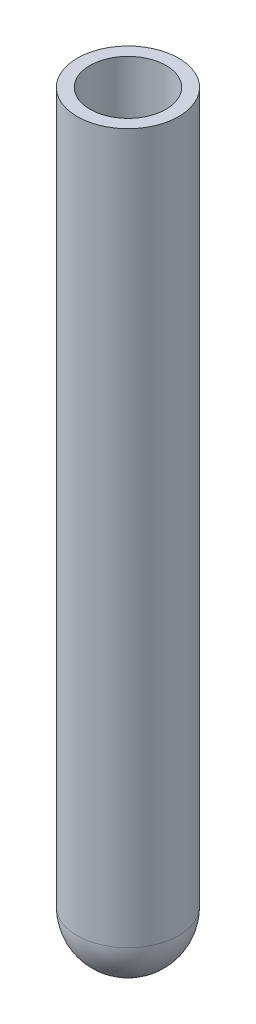
ISO-10303-21;
HEADER;
FILE_DESCRIPTION(('STEP AP214'),'2;1');
FILE_NAME('part.step','',(''),(''),'','','');
FILE_SCHEMA(('AUTOMOTIVE_DESIGN { 1 0 10303 214 1 1 1 1 }'));
ENDSEC;
DATA;
#1=APPLICATION_CONTEXT('core data for automotive mechanical design processes');
#2=APPLICATION_PROTOCOL_DEFINITION('international standard','automotive_design',2000,#1);
#3=PRODUCT_CONTEXT('',#1,'mechanical');
#4=PRODUCT('Part','Part','',(#3));
#5=PRODUCT_RELATED_PRODUCT_CATEGORY('part','',(#4));
#6=PRODUCT_DEFINITION_FORMATION('','',#4);
#7=PRODUCT_DEFINITION_CONTEXT('part definition',#1,'design');
#8=PRODUCT_DEFINITION('design','',#6,#7);
#9=PRODUCT_DEFINITION_SHAPE('','',#8);
#10=(LENGTH_UNIT() NAMED_UNIT(*) SI_UNIT(.MILLI.,.METRE.));
#11=(NAMED_UNIT(*) PLANE_ANGLE_UNIT() SI_UNIT($,.RADIAN.));
#12=(NAMED_UNIT(*) SI_UNIT($,.STERADIAN.) SOLID_ANGLE_UNIT());
#13=UNCERTAINTY_MEASURE_WITH_UNIT(LENGTH_MEASURE(1.E-05),#10,'distance_accuracy_value','');
#14=(GEOMETRIC_REPRESENTATION_CONTEXT(3) GLOBAL_UNCERTAINTY_ASSIGNED_CONTEXT((#13)) GLOBAL_UNIT_ASSIGNED_CONTEXT((#10,
#11,#12)) REPRESENTATION_CONTEXT('',''));
#15=CARTESIAN_POINT('',(0.,0.,0.));
#16=DIRECTION('',(0.,0.,1.));
#17=DIRECTION('',(1.,0.,0.));
#18=AXIS2_PLACEMENT_3D('',#15,#16,#17);
#19=CARTESIAN_POINT('',(0.,0.,0.));
#20=DIRECTION('',(0.,-1.,0.));
#21=DIRECTION('',(-1.,0.,0.));
#22=AXIS2_PLACEMENT_3D('',#19,#20,#21);
#23=SPHERICAL_SURFACE('',#22,5.);
#24=CARTESIAN_POINT('',(0.,0.,0.));
#25=DIRECTION('',(0.,1.,0.));
#26=DIRECTION('',(0.,0.,1.));
#27=AXIS2_PLACEMENT_3D('',#24,#25,#26);
#28=CIRCLE('',#27,5.);
#29=CARTESIAN_POINT('',(0.,0.,5.));
#30=VERTEX_POINT('',#29);
#31=EDGE_CURVE('E53',#30,#30,#28,.T.);
#32=ORIENTED_EDGE('',*,*,#31,.F.);
#33=EDGE_LOOP('',(#32));
#34=FACE_BOUND('',#33,.T.);
#35=ADVANCED_FACE('F41',(#34),#23,.T.);
#36=CARTESIAN_POINT('',(0.,70.,0.));
#37=DIRECTION('',(0.,1.,0.));
#38=DIRECTION('',(0.,0.,1.));
#39=AXIS2_PLACEMENT_3D('',#36,#37,#38);
#40=PLANE('',#39);
#41=CARTESIAN_POINT('',(0.,70.,0.));
#42=DIRECTION('',(0.,1.,0.));
#43=DIRECTION('',(0.,0.,1.));
#44=AXIS2_PLACEMENT_3D('',#41,#42,#43);
#45=CIRCLE('',#44,5.);
#46=CARTESIAN_POINT('',(0.,70.,5.));
#47=VERTEX_POINT('',#46);
#48=EDGE_CURVE('E48',#47,#47,#45,.T.);
#49=ORIENTED_EDGE('',*,*,#48,.T.);
#50=EDGE_LOOP('',(#49));
#51=FACE_BOUND('',#50,.T.);
#52=CARTESIAN_POINT('',(0.,70.,0.));
#53=DIRECTION('',(0.,1.,0.));
#54=DIRECTION('',(0.,0.,1.));
#55=AXIS2_PLACEMENT_3D('',#52,#53,#54);
#56=CIRCLE('',#55,3.75);
#57=CARTESIAN_POINT('',(0.,70.,3.75));
#58=VERTEX_POINT('',#57);
#59=EDGE_CURVE('E59',#58,#58,#56,.T.);
#60=ORIENTED_EDGE('',*,*,#59,.F.);
#61=EDGE_LOOP('',(#60));
#62=FACE_BOUND('',#61,.T.);
#63=ADVANCED_FACE('F67',(#51,#62),#40,.T.);
#64=CARTESIAN_POINT('',(0.,70.,0.));
#65=DIRECTION('',(0.,-1.,0.));
#66=DIRECTION('',(0.,0.,-1.));
#67=AXIS2_PLACEMENT_3D('',#64,#65,#66);
#68=CYLINDRICAL_SURFACE('',#67,5.);
#69=ORIENTED_EDGE('',*,*,#48,.F.);
#70=EDGE_LOOP('',(#69));
#71=FACE_BOUND('',#70,.T.);
#72=ORIENTED_EDGE('',*,*,#31,.T.);
#73=EDGE_LOOP('',(#72));
#74=FACE_BOUND('',#73,.T.);
#75=ADVANCED_FACE('F69',(#71,#74),#68,.T.);
#76=CARTESIAN_POINT('',(0.,70.,0.));
#77=DIRECTION('',(0.,-1.,0.));
#78=DIRECTION('',(0.,0.,-1.));
#79=AXIS2_PLACEMENT_3D('',#76,#77,#78);
#80=CYLINDRICAL_SURFACE('',#79,3.75);
#81=ORIENTED_EDGE('',*,*,#59,.T.);
#82=EDGE_LOOP('',(#81));
#83=FACE_BOUND('',#82,.T.);
#84=CARTESIAN_POINT('',(0.,0.,0.));
#85=DIRECTION('',(0.,1.,0.));
#86=DIRECTION('',(0.,0.,1.));
#87=AXIS2_PLACEMENT_3D('',#84,#85,#86);
#88=CIRCLE('',#87,3.75);
#89=CARTESIAN_POINT('',(0.,0.,3.75));
#90=VERTEX_POINT('',#89);
#91=EDGE_CURVE('E10',#90,#90,#88,.F.);
#92=ORIENTED_EDGE('',*,*,#91,.T.);
#93=EDGE_LOOP('',(#92));
#94=FACE_BOUND('',#93,.T.);
#95=ADVANCED_FACE('F65',(#83,#94),#80,.F.);
#96=CARTESIAN_POINT('',(-5.,0.,0.));
#97=DIRECTION('',(0.,1.,0.));
#98=DIRECTION('',(0.,0.,1.));
#99=AXIS2_PLACEMENT_3D('',#96,#97,#98);
#100=PLANE('',#99);
#101=ORIENTED_EDGE('',*,*,#91,.F.);
#102=EDGE_LOOP('',(#101));
#103=FACE_BOUND('',#102,.T.);
#104=ADVANCED_FACE('F79',(#103),#100,.T.);
#105=CLOSED_SHELL('',(#35,#63,#75,#95,#104));
#106=MANIFOLD_SOLID_BREP('B2',#105);
#107=ADVANCED_BREP_SHAPE_REPRESENTATION('',(#18,#106),#14);
#108=SHAPE_DEFINITION_REPRESENTATION(#9,#107);
ENDSEC;
END-ISO-10303-21;
